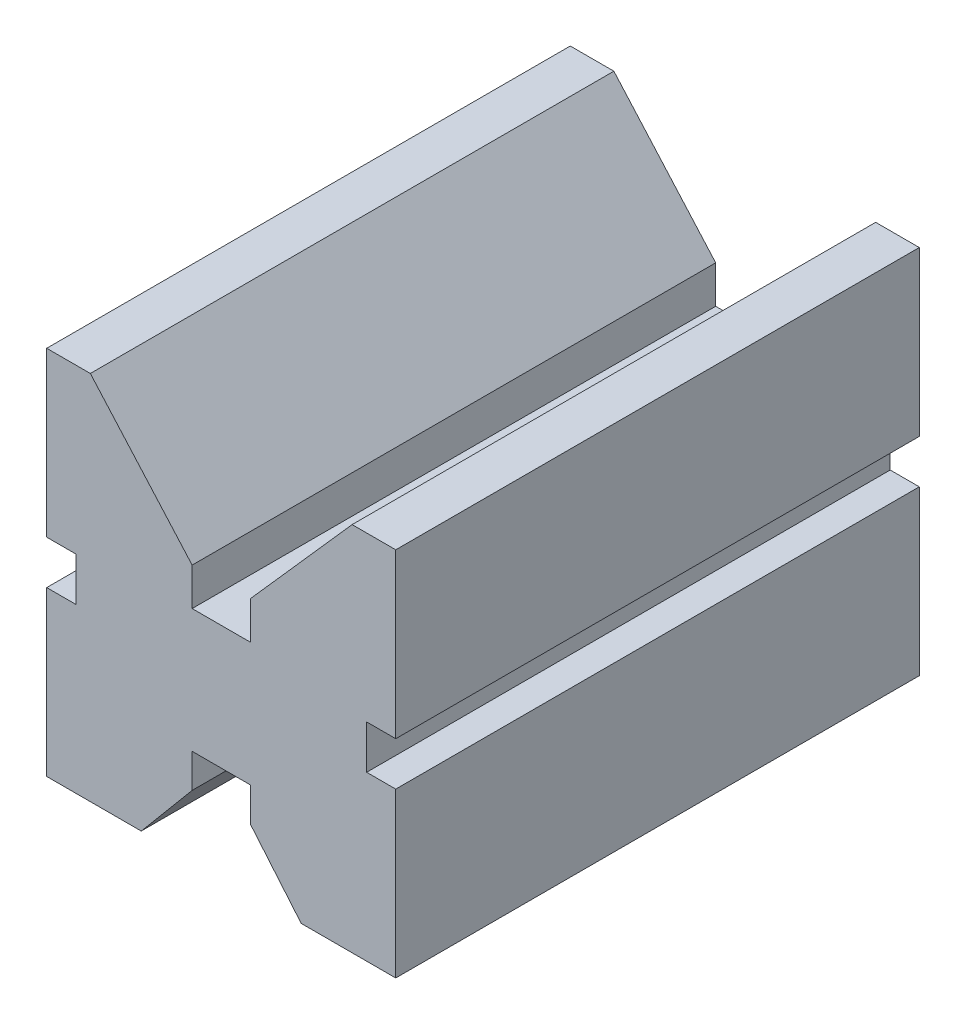
ISO-10303-21;
HEADER;
FILE_DESCRIPTION(('STEP AP214'),'2;1');
FILE_NAME('part.step','',(''),(''),'','','');
FILE_SCHEMA(('AUTOMOTIVE_DESIGN { 1 0 10303 214 1 1 1 1 }'));
ENDSEC;
DATA;
#1=APPLICATION_CONTEXT('core data for automotive mechanical design processes');
#2=APPLICATION_PROTOCOL_DEFINITION('international standard','automotive_design',2000,#1);
#3=PRODUCT_CONTEXT('',#1,'mechanical');
#4=PRODUCT('Part','Part','',(#3));
#5=PRODUCT_RELATED_PRODUCT_CATEGORY('part','',(#4));
#6=PRODUCT_DEFINITION_FORMATION('','',#4);
#7=PRODUCT_DEFINITION_CONTEXT('part definition',#1,'design');
#8=PRODUCT_DEFINITION('design','',#6,#7);
#9=PRODUCT_DEFINITION_SHAPE('','',#8);
#10=(LENGTH_UNIT() NAMED_UNIT(*) SI_UNIT(.MILLI.,.METRE.));
#11=(NAMED_UNIT(*) PLANE_ANGLE_UNIT() SI_UNIT($,.RADIAN.));
#12=(NAMED_UNIT(*) SI_UNIT($,.STERADIAN.) SOLID_ANGLE_UNIT());
#13=UNCERTAINTY_MEASURE_WITH_UNIT(LENGTH_MEASURE(1.E-05),#10,'distance_accuracy_value','');
#14=(GEOMETRIC_REPRESENTATION_CONTEXT(3) GLOBAL_UNCERTAINTY_ASSIGNED_CONTEXT((#13)) GLOBAL_UNIT_ASSIGNED_CONTEXT((#10,
#11,#12)) REPRESENTATION_CONTEXT('',''));
#15=CARTESIAN_POINT('',(0.,0.,0.));
#16=DIRECTION('',(0.,0.,1.));
#17=DIRECTION('',(1.,0.,0.));
#18=AXIS2_PLACEMENT_3D('',#15,#16,#17);
#19=CARTESIAN_POINT('',(24.,-3.,36.));
#20=DIRECTION('',(-1.,0.,0.));
#21=DIRECTION('',(0.,-1.,0.));
#22=AXIS2_PLACEMENT_3D('',#19,#20,#21);
#23=PLANE('',#22);
#24=DIRECTION('',(0.,1.,0.));
#25=VECTOR('',#24,1.);
#26=CARTESIAN_POINT('',(24.,-3.,-36.));
#27=LINE('',#26,#25);
#28=CARTESIAN_POINT('',(24.,-25.5,-36.));
#29=VERTEX_POINT('',#28);
#30=CARTESIAN_POINT('',(24.,-3.,-36.));
#31=VERTEX_POINT('',#30);
#32=EDGE_CURVE('E284',#29,#31,#27,.T.);
#33=ORIENTED_EDGE('',*,*,#32,.T.);
#34=DIRECTION('',(0.,0.,-1.));
#35=VECTOR('',#34,1.);
#36=CARTESIAN_POINT('',(24.,-3.,36.));
#37=LINE('',#36,#35);
#38=CARTESIAN_POINT('',(24.,-3.,36.));
#39=VERTEX_POINT('',#38);
#40=EDGE_CURVE('E11',#39,#31,#37,.T.);
#41=ORIENTED_EDGE('',*,*,#40,.F.);
#42=DIRECTION('',(0.,1.,0.));
#43=VECTOR('',#42,1.);
#44=CARTESIAN_POINT('',(24.,-3.,36.));
#45=LINE('',#44,#43);
#46=CARTESIAN_POINT('',(24.,-25.5,36.));
#47=VERTEX_POINT('',#46);
#48=EDGE_CURVE('E347',#47,#39,#45,.T.);
#49=ORIENTED_EDGE('',*,*,#48,.F.);
#50=DIRECTION('',(0.,0.,-1.));
#51=VECTOR('',#50,1.);
#52=CARTESIAN_POINT('',(24.,-25.5,36.));
#53=LINE('',#52,#51);
#54=EDGE_CURVE('E283',#47,#29,#53,.T.);
#55=ORIENTED_EDGE('',*,*,#54,.T.);
#56=EDGE_LOOP('',(#33,#41,#49,#55));
#57=FACE_BOUND('',#56,.T.);
#58=ADVANCED_FACE('F45',(#57),#23,.F.);
#59=CARTESIAN_POINT('',(24.,-3.,36.));
#60=DIRECTION('',(0.,-1.,0.));
#61=DIRECTION('',(1.,0.,0.));
#62=AXIS2_PLACEMENT_3D('',#59,#60,#61);
#63=PLANE('',#62);
#64=DIRECTION('',(-1.,0.,0.));
#65=VECTOR('',#64,1.);
#66=CARTESIAN_POINT('',(24.,-3.,-36.));
#67=LINE('',#66,#65);
#68=CARTESIAN_POINT('',(20.,-3.,-36.));
#69=VERTEX_POINT('',#68);
#70=EDGE_CURVE('E288',#31,#69,#67,.T.);
#71=ORIENTED_EDGE('',*,*,#70,.T.);
#72=DIRECTION('',(0.,0.,-1.));
#73=VECTOR('',#72,1.);
#74=CARTESIAN_POINT('',(20.,-3.,36.));
#75=LINE('',#74,#73);
#76=CARTESIAN_POINT('',(20.,-3.,36.));
#77=VERTEX_POINT('',#76);
#78=EDGE_CURVE('E53',#77,#69,#75,.T.);
#79=ORIENTED_EDGE('',*,*,#78,.F.);
#80=DIRECTION('',(-1.,0.,0.));
#81=VECTOR('',#80,1.);
#82=CARTESIAN_POINT('',(24.,-3.,36.));
#83=LINE('',#82,#81);
#84=EDGE_CURVE('E470',#39,#77,#83,.T.);
#85=ORIENTED_EDGE('',*,*,#84,.F.);
#86=ORIENTED_EDGE('',*,*,#40,.T.);
#87=EDGE_LOOP('',(#71,#79,#85,#86));
#88=FACE_BOUND('',#87,.T.);
#89=ADVANCED_FACE('F477',(#88),#63,.F.);
#90=CARTESIAN_POINT('',(20.,3.,36.));
#91=DIRECTION('',(-1.,0.,0.));
#92=DIRECTION('',(0.,0.,1.));
#93=AXIS2_PLACEMENT_3D('',#90,#91,#92);
#94=PLANE('',#93);
#95=DIRECTION('',(0.,1.,0.));
#96=VECTOR('',#95,1.);
#97=CARTESIAN_POINT('',(20.,3.,-36.));
#98=LINE('',#97,#96);
#99=CARTESIAN_POINT('',(20.,3.,-36.));
#100=VERTEX_POINT('',#99);
#101=EDGE_CURVE('E291',#69,#100,#98,.T.);
#102=ORIENTED_EDGE('',*,*,#101,.T.);
#103=DIRECTION('',(0.,0.,-1.));
#104=VECTOR('',#103,1.);
#105=CARTESIAN_POINT('',(20.,3.,36.));
#106=LINE('',#105,#104);
#107=CARTESIAN_POINT('',(20.,3.,36.));
#108=VERTEX_POINT('',#107);
#109=EDGE_CURVE('E398',#108,#100,#106,.T.);
#110=ORIENTED_EDGE('',*,*,#109,.F.);
#111=DIRECTION('',(0.,1.,0.));
#112=VECTOR('',#111,1.);
#113=CARTESIAN_POINT('',(20.,3.,36.));
#114=LINE('',#113,#112);
#115=EDGE_CURVE('E409',#77,#108,#114,.T.);
#116=ORIENTED_EDGE('',*,*,#115,.F.);
#117=ORIENTED_EDGE('',*,*,#78,.T.);
#118=EDGE_LOOP('',(#102,#110,#116,#117));
#119=FACE_BOUND('',#118,.T.);
#120=ADVANCED_FACE('F407',(#119),#94,.F.);
#121=CARTESIAN_POINT('',(24.,3.,36.));
#122=DIRECTION('',(0.,1.,0.));
#123=DIRECTION('',(-1.,0.,0.));
#124=AXIS2_PLACEMENT_3D('',#121,#122,#123);
#125=PLANE('',#124);
#126=DIRECTION('',(1.,0.,0.));
#127=VECTOR('',#126,1.);
#128=CARTESIAN_POINT('',(24.,3.,-36.));
#129=LINE('',#128,#127);
#130=CARTESIAN_POINT('',(24.,3.,-36.));
#131=VERTEX_POINT('',#130);
#132=EDGE_CURVE('E294',#100,#131,#129,.T.);
#133=ORIENTED_EDGE('',*,*,#132,.T.);
#134=DIRECTION('',(0.,0.,-1.));
#135=VECTOR('',#134,1.);
#136=CARTESIAN_POINT('',(24.,3.,36.));
#137=LINE('',#136,#135);
#138=CARTESIAN_POINT('',(24.,3.,36.));
#139=VERTEX_POINT('',#138);
#140=EDGE_CURVE('E394',#139,#131,#137,.T.);
#141=ORIENTED_EDGE('',*,*,#140,.F.);
#142=DIRECTION('',(1.,0.,0.));
#143=VECTOR('',#142,1.);
#144=CARTESIAN_POINT('',(24.,3.,36.));
#145=LINE('',#144,#143);
#146=EDGE_CURVE('E238',#108,#139,#145,.T.);
#147=ORIENTED_EDGE('',*,*,#146,.F.);
#148=ORIENTED_EDGE('',*,*,#109,.T.);
#149=EDGE_LOOP('',(#133,#141,#147,#148));
#150=FACE_BOUND('',#149,.T.);
#151=ADVANCED_FACE('F419',(#150),#125,.F.);
#152=CARTESIAN_POINT('',(24.,25.5,36.));
#153=DIRECTION('',(-1.,0.,0.));
#154=DIRECTION('',(0.,-1.,0.));
#155=AXIS2_PLACEMENT_3D('',#152,#153,#154);
#156=PLANE('',#155);
#157=DIRECTION('',(0.,1.,0.));
#158=VECTOR('',#157,1.);
#159=CARTESIAN_POINT('',(24.,25.5,-36.));
#160=LINE('',#159,#158);
#161=CARTESIAN_POINT('',(24.,25.5,-36.));
#162=VERTEX_POINT('',#161);
#163=EDGE_CURVE('E297',#131,#162,#160,.T.);
#164=ORIENTED_EDGE('',*,*,#163,.T.);
#165=DIRECTION('',(0.,0.,-1.));
#166=VECTOR('',#165,1.);
#167=CARTESIAN_POINT('',(24.,25.5,36.));
#168=LINE('',#167,#166);
#169=CARTESIAN_POINT('',(24.,25.5,36.));
#170=VERTEX_POINT('',#169);
#171=EDGE_CURVE('E391',#170,#162,#168,.T.);
#172=ORIENTED_EDGE('',*,*,#171,.F.);
#173=DIRECTION('',(0.,1.,0.));
#174=VECTOR('',#173,1.);
#175=CARTESIAN_POINT('',(24.,25.5,36.));
#176=LINE('',#175,#174);
#177=EDGE_CURVE('E229',#139,#170,#176,.T.);
#178=ORIENTED_EDGE('',*,*,#177,.F.);
#179=ORIENTED_EDGE('',*,*,#140,.T.);
#180=EDGE_LOOP('',(#164,#172,#178,#179));
#181=FACE_BOUND('',#180,.T.);
#182=ADVANCED_FACE('F422',(#181),#156,.F.);
#183=CARTESIAN_POINT('',(3.99999999999999,25.5,36.));
#184=DIRECTION('',(0.,-1.,0.));
#185=DIRECTION('',(1.,0.,0.));
#186=AXIS2_PLACEMENT_3D('',#183,#184,#185);
#187=PLANE('',#186);
#188=DIRECTION('',(-1.,0.,0.));
#189=VECTOR('',#188,1.);
#190=CARTESIAN_POINT('',(3.99999999999999,25.5,-36.));
#191=LINE('',#190,#189);
#192=CARTESIAN_POINT('',(18.,25.5,-36.));
#193=VERTEX_POINT('',#192);
#194=EDGE_CURVE('E222',#162,#193,#191,.T.);
#195=ORIENTED_EDGE('',*,*,#194,.T.);
#196=DIRECTION('',(0.,0.,1.));
#197=VECTOR('',#196,1.);
#198=CARTESIAN_POINT('',(18.,25.5,-36.));
#199=LINE('',#198,#197);
#200=CARTESIAN_POINT('',(18.,25.5,36.));
#201=VERTEX_POINT('',#200);
#202=EDGE_CURVE('E60',#193,#201,#199,.T.);
#203=ORIENTED_EDGE('',*,*,#202,.T.);
#204=DIRECTION('',(-1.,0.,0.));
#205=VECTOR('',#204,1.);
#206=CARTESIAN_POINT('',(3.99999999999999,25.5,36.));
#207=LINE('',#206,#205);
#208=EDGE_CURVE('E220',#170,#201,#207,.T.);
#209=ORIENTED_EDGE('',*,*,#208,.F.);
#210=ORIENTED_EDGE('',*,*,#171,.T.);
#211=EDGE_LOOP('',(#195,#203,#209,#210));
#212=FACE_BOUND('',#211,.T.);
#213=ADVANCED_FACE('F218',(#212),#187,.F.);
#214=CARTESIAN_POINT('',(3.99999999999999,25.5,36.));
#215=DIRECTION('',(1.,0.,0.));
#216=DIRECTION('',(0.,1.,0.));
#217=AXIS2_PLACEMENT_3D('',#214,#215,#216);
#218=PLANE('',#217);
#219=DIRECTION('',(0.,-1.,0.));
#220=VECTOR('',#219,1.);
#221=CARTESIAN_POINT('',(3.99999999999999,25.5,36.));
#222=LINE('',#221,#220);
#223=CARTESIAN_POINT('',(4.00000000000001,9.67587859093549,36.));
#224=VERTEX_POINT('',#223);
#225=CARTESIAN_POINT('',(4.,4.49999999999999,36.));
#226=VERTEX_POINT('',#225);
#227=EDGE_CURVE('E232',#224,#226,#222,.T.);
#228=ORIENTED_EDGE('',*,*,#227,.F.);
#229=DIRECTION('',(0.,0.,1.));
#230=VECTOR('',#229,1.);
#231=CARTESIAN_POINT('',(4.00000000000001,9.67587859093549,-36.));
#232=LINE('',#231,#230);
#233=CARTESIAN_POINT('',(4.00000000000001,9.67587859093549,-36.));
#234=VERTEX_POINT('',#233);
#235=EDGE_CURVE('E207',#234,#224,#232,.T.);
#236=ORIENTED_EDGE('',*,*,#235,.F.);
#237=DIRECTION('',(0.,-1.,0.));
#238=VECTOR('',#237,1.);
#239=CARTESIAN_POINT('',(3.99999999999999,25.5,-36.));
#240=LINE('',#239,#238);
#241=CARTESIAN_POINT('',(4.,4.49999999999999,-36.));
#242=VERTEX_POINT('',#241);
#243=EDGE_CURVE('E302',#234,#242,#240,.T.);
#244=ORIENTED_EDGE('',*,*,#243,.T.);
#245=DIRECTION('',(0.,0.,-1.));
#246=VECTOR('',#245,1.);
#247=CARTESIAN_POINT('',(4.,4.49999999999999,36.));
#248=LINE('',#247,#246);
#249=EDGE_CURVE('E387',#226,#242,#248,.T.);
#250=ORIENTED_EDGE('',*,*,#249,.F.);
#251=EDGE_LOOP('',(#228,#236,#244,#250));
#252=FACE_BOUND('',#251,.T.);
#253=ADVANCED_FACE('F549',(#252),#218,.F.);
#254=CARTESIAN_POINT('',(-4.00000000000001,4.49999999999999,36.));
#255=DIRECTION('',(0.,-1.,0.));
#256=DIRECTION('',(0.,0.,-1.));
#257=AXIS2_PLACEMENT_3D('',#254,#255,#256);
#258=PLANE('',#257);
#259=DIRECTION('',(-1.,0.,0.));
#260=VECTOR('',#259,1.);
#261=CARTESIAN_POINT('',(-4.00000000000001,4.49999999999999,-36.));
#262=LINE('',#261,#260);
#263=CARTESIAN_POINT('',(-4.00000000000001,4.49999999999999,-36.));
#264=VERTEX_POINT('',#263);
#265=EDGE_CURVE('E305',#242,#264,#262,.T.);
#266=ORIENTED_EDGE('',*,*,#265,.T.);
#267=DIRECTION('',(0.,0.,-1.));
#268=VECTOR('',#267,1.);
#269=CARTESIAN_POINT('',(-4.00000000000001,4.49999999999999,36.));
#270=LINE('',#269,#268);
#271=CARTESIAN_POINT('',(-4.00000000000001,4.49999999999999,36.));
#272=VERTEX_POINT('',#271);
#273=EDGE_CURVE('E383',#272,#264,#270,.T.);
#274=ORIENTED_EDGE('',*,*,#273,.F.);
#275=DIRECTION('',(-1.,0.,0.));
#276=VECTOR('',#275,1.);
#277=CARTESIAN_POINT('',(-4.00000000000001,4.49999999999999,36.));
#278=LINE('',#277,#276);
#279=EDGE_CURVE('E236',#226,#272,#278,.T.);
#280=ORIENTED_EDGE('',*,*,#279,.F.);
#281=ORIENTED_EDGE('',*,*,#249,.T.);
#282=EDGE_LOOP('',(#266,#274,#280,#281));
#283=FACE_BOUND('',#282,.T.);
#284=ADVANCED_FACE('F546',(#283),#258,.F.);
#285=CARTESIAN_POINT('',(-4.,25.5,36.));
#286=DIRECTION('',(-1.,0.,0.));
#287=DIRECTION('',(0.,-1.,0.));
#288=AXIS2_PLACEMENT_3D('',#285,#286,#287);
#289=PLANE('',#288);
#290=DIRECTION('',(0.,1.,0.));
#291=VECTOR('',#290,1.);
#292=CARTESIAN_POINT('',(-4.,25.5,-36.));
#293=LINE('',#292,#291);
#294=CARTESIAN_POINT('',(-4.00000000000001,9.6758785909355,-36.));
#295=VERTEX_POINT('',#294);
#296=EDGE_CURVE('E308',#264,#295,#293,.T.);
#297=ORIENTED_EDGE('',*,*,#296,.T.);
#298=DIRECTION('',(0.,0.,1.));
#299=VECTOR('',#298,1.);
#300=CARTESIAN_POINT('',(-4.00000000000001,9.67587859093549,-36.));
#301=LINE('',#300,#299);
#302=CARTESIAN_POINT('',(-4.00000000000001,9.67587859093549,36.));
#303=VERTEX_POINT('',#302);
#304=EDGE_CURVE('E68',#295,#303,#301,.T.);
#305=ORIENTED_EDGE('',*,*,#304,.T.);
#306=DIRECTION('',(0.,1.,0.));
#307=VECTOR('',#306,1.);
#308=CARTESIAN_POINT('',(-4.,25.5,36.));
#309=LINE('',#308,#307);
#310=EDGE_CURVE('E244',#272,#303,#309,.T.);
#311=ORIENTED_EDGE('',*,*,#310,.F.);
#312=ORIENTED_EDGE('',*,*,#273,.T.);
#313=EDGE_LOOP('',(#297,#305,#311,#312));
#314=FACE_BOUND('',#313,.T.);
#315=ADVANCED_FACE('F541',(#314),#289,.F.);
#316=CARTESIAN_POINT('',(-24.,25.5,36.));
#317=DIRECTION('',(0.,-1.,0.));
#318=DIRECTION('',(1.,0.,0.));
#319=AXIS2_PLACEMENT_3D('',#316,#317,#318);
#320=PLANE('',#319);
#321=DIRECTION('',(-1.,0.,0.));
#322=VECTOR('',#321,1.);
#323=CARTESIAN_POINT('',(-24.,25.5,36.));
#324=LINE('',#323,#322);
#325=CARTESIAN_POINT('',(-18.,25.5,36.));
#326=VERTEX_POINT('',#325);
#327=CARTESIAN_POINT('',(-24.,25.5,36.));
#328=VERTEX_POINT('',#327);
#329=EDGE_CURVE('E248',#326,#328,#324,.T.);
#330=ORIENTED_EDGE('',*,*,#329,.F.);
#331=DIRECTION('',(0.,0.,1.));
#332=VECTOR('',#331,1.);
#333=CARTESIAN_POINT('',(-18.,25.5,-36.));
#334=LINE('',#333,#332);
#335=CARTESIAN_POINT('',(-18.,25.5,-36.));
#336=VERTEX_POINT('',#335);
#337=EDGE_CURVE('E460',#336,#326,#334,.T.);
#338=ORIENTED_EDGE('',*,*,#337,.F.);
#339=DIRECTION('',(-1.,0.,0.));
#340=VECTOR('',#339,1.);
#341=CARTESIAN_POINT('',(-24.,25.5,-36.));
#342=LINE('',#341,#340);
#343=CARTESIAN_POINT('',(-24.,25.5,-36.));
#344=VERTEX_POINT('',#343);
#345=EDGE_CURVE('E312',#336,#344,#342,.T.);
#346=ORIENTED_EDGE('',*,*,#345,.T.);
#347=DIRECTION('',(0.,0.,-1.));
#348=VECTOR('',#347,1.);
#349=CARTESIAN_POINT('',(-24.,25.5,36.));
#350=LINE('',#349,#348);
#351=EDGE_CURVE('E379',#328,#344,#350,.T.);
#352=ORIENTED_EDGE('',*,*,#351,.F.);
#353=EDGE_LOOP('',(#330,#338,#346,#352));
#354=FACE_BOUND('',#353,.T.);
#355=ADVANCED_FACE('F537',(#354),#320,.F.);
#356=CARTESIAN_POINT('',(-24.,25.5,36.));
#357=DIRECTION('',(1.,0.,0.));
#358=DIRECTION('',(0.,1.,0.));
#359=AXIS2_PLACEMENT_3D('',#356,#357,#358);
#360=PLANE('',#359);
#361=DIRECTION('',(0.,-1.,0.));
#362=VECTOR('',#361,1.);
#363=CARTESIAN_POINT('',(-24.,25.5,-36.));
#364=LINE('',#363,#362);
#365=CARTESIAN_POINT('',(-24.,3.,-36.));
#366=VERTEX_POINT('',#365);
#367=EDGE_CURVE('E315',#344,#366,#364,.T.);
#368=ORIENTED_EDGE('',*,*,#367,.T.);
#369=DIRECTION('',(0.,0.,-1.));
#370=VECTOR('',#369,1.);
#371=CARTESIAN_POINT('',(-24.,3.,36.));
#372=LINE('',#371,#370);
#373=CARTESIAN_POINT('',(-24.,3.,36.));
#374=VERTEX_POINT('',#373);
#375=EDGE_CURVE('E375',#374,#366,#372,.T.);
#376=ORIENTED_EDGE('',*,*,#375,.F.);
#377=DIRECTION('',(0.,-1.,0.));
#378=VECTOR('',#377,1.);
#379=CARTESIAN_POINT('',(-24.,25.5,36.));
#380=LINE('',#379,#378);
#381=EDGE_CURVE('E251',#328,#374,#380,.T.);
#382=ORIENTED_EDGE('',*,*,#381,.F.);
#383=ORIENTED_EDGE('',*,*,#351,.T.);
#384=EDGE_LOOP('',(#368,#376,#382,#383));
#385=FACE_BOUND('',#384,.T.);
#386=ADVANCED_FACE('F533',(#385),#360,.F.);
#387=CARTESIAN_POINT('',(-24.,3.,36.));
#388=DIRECTION('',(0.,1.,0.));
#389=DIRECTION('',(-1.,0.,0.));
#390=AXIS2_PLACEMENT_3D('',#387,#388,#389);
#391=PLANE('',#390);
#392=DIRECTION('',(1.,0.,0.));
#393=VECTOR('',#392,1.);
#394=CARTESIAN_POINT('',(-24.,3.,-36.));
#395=LINE('',#394,#393);
#396=CARTESIAN_POINT('',(-20.,3.,-36.));
#397=VERTEX_POINT('',#396);
#398=EDGE_CURVE('E318',#366,#397,#395,.T.);
#399=ORIENTED_EDGE('',*,*,#398,.T.);
#400=DIRECTION('',(0.,0.,-1.));
#401=VECTOR('',#400,1.);
#402=CARTESIAN_POINT('',(-20.,3.,36.));
#403=LINE('',#402,#401);
#404=CARTESIAN_POINT('',(-20.,3.,36.));
#405=VERTEX_POINT('',#404);
#406=EDGE_CURVE('E371',#405,#397,#403,.T.);
#407=ORIENTED_EDGE('',*,*,#406,.F.);
#408=DIRECTION('',(1.,0.,0.));
#409=VECTOR('',#408,1.);
#410=CARTESIAN_POINT('',(-24.,3.,36.));
#411=LINE('',#410,#409);
#412=EDGE_CURVE('E254',#374,#405,#411,.T.);
#413=ORIENTED_EDGE('',*,*,#412,.F.);
#414=ORIENTED_EDGE('',*,*,#375,.T.);
#415=EDGE_LOOP('',(#399,#407,#413,#414));
#416=FACE_BOUND('',#415,.T.);
#417=ADVANCED_FACE('F528',(#416),#391,.F.);
#418=CARTESIAN_POINT('',(-20.,3.,36.));
#419=DIRECTION('',(1.,0.,0.));
#420=DIRECTION('',(0.,0.,-1.));
#421=AXIS2_PLACEMENT_3D('',#418,#419,#420);
#422=PLANE('',#421);
#423=DIRECTION('',(0.,-1.,0.));
#424=VECTOR('',#423,1.);
#425=CARTESIAN_POINT('',(-20.,3.,-36.));
#426=LINE('',#425,#424);
#427=CARTESIAN_POINT('',(-20.,-3.,-36.));
#428=VERTEX_POINT('',#427);
#429=EDGE_CURVE('E321',#397,#428,#426,.T.);
#430=ORIENTED_EDGE('',*,*,#429,.T.);
#431=DIRECTION('',(0.,0.,-1.));
#432=VECTOR('',#431,1.);
#433=CARTESIAN_POINT('',(-20.,-3.,36.));
#434=LINE('',#433,#432);
#435=CARTESIAN_POINT('',(-20.,-3.,36.));
#436=VERTEX_POINT('',#435);
#437=EDGE_CURVE('E367',#436,#428,#434,.T.);
#438=ORIENTED_EDGE('',*,*,#437,.F.);
#439=DIRECTION('',(0.,-1.,0.));
#440=VECTOR('',#439,1.);
#441=CARTESIAN_POINT('',(-20.,3.,36.));
#442=LINE('',#441,#440);
#443=EDGE_CURVE('E257',#405,#436,#442,.T.);
#444=ORIENTED_EDGE('',*,*,#443,.F.);
#445=ORIENTED_EDGE('',*,*,#406,.T.);
#446=EDGE_LOOP('',(#430,#438,#444,#445));
#447=FACE_BOUND('',#446,.T.);
#448=ADVANCED_FACE('F522',(#447),#422,.F.);
#449=CARTESIAN_POINT('',(-24.,-3.,36.));
#450=DIRECTION('',(0.,-1.,0.));
#451=DIRECTION('',(1.,0.,0.));
#452=AXIS2_PLACEMENT_3D('',#449,#450,#451);
#453=PLANE('',#452);
#454=DIRECTION('',(-1.,0.,0.));
#455=VECTOR('',#454,1.);
#456=CARTESIAN_POINT('',(-24.,-3.,-36.));
#457=LINE('',#456,#455);
#458=CARTESIAN_POINT('',(-24.,-3.,-36.));
#459=VERTEX_POINT('',#458);
#460=EDGE_CURVE('E324',#428,#459,#457,.T.);
#461=ORIENTED_EDGE('',*,*,#460,.T.);
#462=DIRECTION('',(0.,0.,-1.));
#463=VECTOR('',#462,1.);
#464=CARTESIAN_POINT('',(-24.,-3.,36.));
#465=LINE('',#464,#463);
#466=CARTESIAN_POINT('',(-24.,-3.,36.));
#467=VERTEX_POINT('',#466);
#468=EDGE_CURVE('E363',#467,#459,#465,.T.);
#469=ORIENTED_EDGE('',*,*,#468,.F.);
#470=DIRECTION('',(-1.,0.,0.));
#471=VECTOR('',#470,1.);
#472=CARTESIAN_POINT('',(-24.,-3.,36.));
#473=LINE('',#472,#471);
#474=EDGE_CURVE('E260',#436,#467,#473,.T.);
#475=ORIENTED_EDGE('',*,*,#474,.F.);
#476=ORIENTED_EDGE('',*,*,#437,.T.);
#477=EDGE_LOOP('',(#461,#469,#475,#476));
#478=FACE_BOUND('',#477,.T.);
#479=ADVANCED_FACE('F518',(#478),#453,.F.);
#480=CARTESIAN_POINT('',(-24.,-3.,36.));
#481=DIRECTION('',(1.,0.,0.));
#482=DIRECTION('',(0.,1.,0.));
#483=AXIS2_PLACEMENT_3D('',#480,#481,#482);
#484=PLANE('',#483);
#485=DIRECTION('',(0.,-1.,0.));
#486=VECTOR('',#485,1.);
#487=CARTESIAN_POINT('',(-24.,-3.,-36.));
#488=LINE('',#487,#486);
#489=CARTESIAN_POINT('',(-24.,-25.5,-36.));
#490=VERTEX_POINT('',#489);
#491=EDGE_CURVE('E327',#459,#490,#488,.T.);
#492=ORIENTED_EDGE('',*,*,#491,.T.);
#493=DIRECTION('',(0.,0.,-1.));
#494=VECTOR('',#493,1.);
#495=CARTESIAN_POINT('',(-24.,-25.5,36.));
#496=LINE('',#495,#494);
#497=CARTESIAN_POINT('',(-24.,-25.5,36.));
#498=VERTEX_POINT('',#497);
#499=EDGE_CURVE('E359',#498,#490,#496,.T.);
#500=ORIENTED_EDGE('',*,*,#499,.F.);
#501=DIRECTION('',(0.,-1.,0.));
#502=VECTOR('',#501,1.);
#503=CARTESIAN_POINT('',(-24.,-3.,36.));
#504=LINE('',#503,#502);
#505=EDGE_CURVE('E263',#467,#498,#504,.T.);
#506=ORIENTED_EDGE('',*,*,#505,.F.);
#507=ORIENTED_EDGE('',*,*,#468,.T.);
#508=EDGE_LOOP('',(#492,#500,#506,#507));
#509=FACE_BOUND('',#508,.T.);
#510=ADVANCED_FACE('F514',(#509),#484,.F.);
#511=CARTESIAN_POINT('',(-24.,-25.5,36.));
#512=DIRECTION('',(0.,1.,0.));
#513=DIRECTION('',(-1.,0.,0.));
#514=AXIS2_PLACEMENT_3D('',#511,#512,#513);
#515=PLANE('',#514);
#516=DIRECTION('',(1.,0.,0.));
#517=VECTOR('',#516,1.);
#518=CARTESIAN_POINT('',(-24.,-25.5,-36.));
#519=LINE('',#518,#517);
#520=CARTESIAN_POINT('',(-11.,-25.5,-36.));
#521=VERTEX_POINT('',#520);
#522=EDGE_CURVE('E330',#490,#521,#519,.T.);
#523=ORIENTED_EDGE('',*,*,#522,.T.);
#524=DIRECTION('',(0.,0.,1.));
#525=VECTOR('',#524,1.);
#526=CARTESIAN_POINT('',(-11.,-25.5,-36.));
#527=LINE('',#526,#525);
#528=CARTESIAN_POINT('',(-11.,-25.5,36.));
#529=VERTEX_POINT('',#528);
#530=EDGE_CURVE('E448',#521,#529,#527,.T.);
#531=ORIENTED_EDGE('',*,*,#530,.T.);
#532=DIRECTION('',(1.,0.,0.));
#533=VECTOR('',#532,1.);
#534=CARTESIAN_POINT('',(-24.,-25.5,36.));
#535=LINE('',#534,#533);
#536=EDGE_CURVE('E266',#498,#529,#535,.T.);
#537=ORIENTED_EDGE('',*,*,#536,.F.);
#538=ORIENTED_EDGE('',*,*,#499,.T.);
#539=EDGE_LOOP('',(#523,#531,#537,#538));
#540=FACE_BOUND('',#539,.T.);
#541=ADVANCED_FACE('F508',(#540),#515,.F.);
#542=CARTESIAN_POINT('',(-4.,-25.5,36.));
#543=DIRECTION('',(-1.,0.,0.));
#544=DIRECTION('',(0.,-1.,0.));
#545=AXIS2_PLACEMENT_3D('',#542,#543,#544);
#546=PLANE('',#545);
#547=DIRECTION('',(0.,1.,0.));
#548=VECTOR('',#547,1.);
#549=CARTESIAN_POINT('',(-4.,-25.5,36.));
#550=LINE('',#549,#548);
#551=CARTESIAN_POINT('',(-4.,-17.1577248518405,36.));
#552=VERTEX_POINT('',#551);
#553=CARTESIAN_POINT('',(-4.,-12.5,36.));
#554=VERTEX_POINT('',#553);
#555=EDGE_CURVE('E270',#552,#554,#550,.T.);
#556=ORIENTED_EDGE('',*,*,#555,.F.);
#557=DIRECTION('',(0.,0.,1.));
#558=VECTOR('',#557,1.);
#559=CARTESIAN_POINT('',(-4.,-17.1577248518405,-36.));
#560=LINE('',#559,#558);
#561=CARTESIAN_POINT('',(-4.,-17.1577248518405,-36.));
#562=VERTEX_POINT('',#561);
#563=EDGE_CURVE('E444',#562,#552,#560,.T.);
#564=ORIENTED_EDGE('',*,*,#563,.F.);
#565=DIRECTION('',(0.,1.,0.));
#566=VECTOR('',#565,1.);
#567=CARTESIAN_POINT('',(-4.,-25.5,-36.));
#568=LINE('',#567,#566);
#569=CARTESIAN_POINT('',(-4.,-12.5,-36.));
#570=VERTEX_POINT('',#569);
#571=EDGE_CURVE('E334',#562,#570,#568,.T.);
#572=ORIENTED_EDGE('',*,*,#571,.T.);
#573=DIRECTION('',(0.,0.,-1.));
#574=VECTOR('',#573,1.);
#575=CARTESIAN_POINT('',(-4.,-12.5,36.));
#576=LINE('',#575,#574);
#577=EDGE_CURVE('E355',#554,#570,#576,.T.);
#578=ORIENTED_EDGE('',*,*,#577,.F.);
#579=EDGE_LOOP('',(#556,#564,#572,#578));
#580=FACE_BOUND('',#579,.T.);
#581=ADVANCED_FACE('F500',(#580),#546,.F.);
#582=CARTESIAN_POINT('',(-4.,-12.5,36.));
#583=DIRECTION('',(0.,1.,0.));
#584=DIRECTION('',(0.,0.,1.));
#585=AXIS2_PLACEMENT_3D('',#582,#583,#584);
#586=PLANE('',#585);
#587=DIRECTION('',(1.,0.,0.));
#588=VECTOR('',#587,1.);
#589=CARTESIAN_POINT('',(-4.,-12.5,-36.));
#590=LINE('',#589,#588);
#591=CARTESIAN_POINT('',(4.,-12.5,-36.));
#592=VERTEX_POINT('',#591);
#593=EDGE_CURVE('E337',#570,#592,#590,.T.);
#594=ORIENTED_EDGE('',*,*,#593,.T.);
#595=DIRECTION('',(0.,0.,-1.));
#596=VECTOR('',#595,1.);
#597=CARTESIAN_POINT('',(4.,-12.5,36.));
#598=LINE('',#597,#596);
#599=CARTESIAN_POINT('',(4.,-12.5,36.));
#600=VERTEX_POINT('',#599);
#601=EDGE_CURVE('E351',#600,#592,#598,.T.);
#602=ORIENTED_EDGE('',*,*,#601,.F.);
#603=DIRECTION('',(1.,0.,0.));
#604=VECTOR('',#603,1.);
#605=CARTESIAN_POINT('',(-4.,-12.5,36.));
#606=LINE('',#605,#604);
#607=EDGE_CURVE('E273',#554,#600,#606,.T.);
#608=ORIENTED_EDGE('',*,*,#607,.F.);
#609=ORIENTED_EDGE('',*,*,#577,.T.);
#610=EDGE_LOOP('',(#594,#602,#608,#609));
#611=FACE_BOUND('',#610,.T.);
#612=ADVANCED_FACE('F496',(#611),#586,.F.);
#613=CARTESIAN_POINT('',(3.99999999999999,-25.5,36.));
#614=DIRECTION('',(1.,0.,0.));
#615=DIRECTION('',(0.,1.,0.));
#616=AXIS2_PLACEMENT_3D('',#613,#614,#615);
#617=PLANE('',#616);
#618=DIRECTION('',(0.,-1.,0.));
#619=VECTOR('',#618,1.);
#620=CARTESIAN_POINT('',(3.99999999999999,-25.5,-36.));
#621=LINE('',#620,#619);
#622=CARTESIAN_POINT('',(4.,-17.1577248518405,-36.));
#623=VERTEX_POINT('',#622);
#624=EDGE_CURVE('E340',#592,#623,#621,.T.);
#625=ORIENTED_EDGE('',*,*,#624,.T.);
#626=DIRECTION('',(0.,0.,1.));
#627=VECTOR('',#626,1.);
#628=CARTESIAN_POINT('',(4.,-17.1577248518405,-36.));
#629=LINE('',#628,#627);
#630=CARTESIAN_POINT('',(4.,-17.1577248518405,36.));
#631=VERTEX_POINT('',#630);
#632=EDGE_CURVE('E434',#623,#631,#629,.T.);
#633=ORIENTED_EDGE('',*,*,#632,.T.);
#634=DIRECTION('',(0.,-1.,0.));
#635=VECTOR('',#634,1.);
#636=CARTESIAN_POINT('',(3.99999999999999,-25.5,36.));
#637=LINE('',#636,#635);
#638=EDGE_CURVE('E276',#600,#631,#637,.T.);
#639=ORIENTED_EDGE('',*,*,#638,.F.);
#640=ORIENTED_EDGE('',*,*,#601,.T.);
#641=EDGE_LOOP('',(#625,#633,#639,#640));
#642=FACE_BOUND('',#641,.T.);
#643=ADVANCED_FACE('F493',(#642),#617,.F.);
#644=CARTESIAN_POINT('',(3.99999999999999,-25.5,36.));
#645=DIRECTION('',(0.,1.,0.));
#646=DIRECTION('',(-1.,0.,0.));
#647=AXIS2_PLACEMENT_3D('',#644,#645,#646);
#648=PLANE('',#647);
#649=DIRECTION('',(1.,0.,0.));
#650=VECTOR('',#649,1.);
#651=CARTESIAN_POINT('',(3.99999999999999,-25.5,36.));
#652=LINE('',#651,#650);
#653=CARTESIAN_POINT('',(11.,-25.5,36.));
#654=VERTEX_POINT('',#653);
#655=EDGE_CURVE('E280',#654,#47,#652,.T.);
#656=ORIENTED_EDGE('',*,*,#655,.F.);
#657=DIRECTION('',(0.,0.,1.));
#658=VECTOR('',#657,1.);
#659=CARTESIAN_POINT('',(11.,-25.5,-36.));
#660=LINE('',#659,#658);
#661=CARTESIAN_POINT('',(11.,-25.5,-36.));
#662=VERTEX_POINT('',#661);
#663=EDGE_CURVE('E430',#662,#654,#660,.T.);
#664=ORIENTED_EDGE('',*,*,#663,.F.);
#665=DIRECTION('',(1.,0.,0.));
#666=VECTOR('',#665,1.);
#667=CARTESIAN_POINT('',(3.99999999999999,-25.5,-36.));
#668=LINE('',#667,#666);
#669=EDGE_CURVE('E344',#662,#29,#668,.T.);
#670=ORIENTED_EDGE('',*,*,#669,.T.);
#671=ORIENTED_EDGE('',*,*,#54,.F.);
#672=EDGE_LOOP('',(#656,#664,#670,#671));
#673=FACE_BOUND('',#672,.T.);
#674=ADVANCED_FACE('F485',(#673),#648,.F.);
#675=CARTESIAN_POINT('',(0.,0.,36.));
#676=DIRECTION('',(0.,0.,1.));
#677=DIRECTION('',(1.,0.,0.));
#678=AXIS2_PLACEMENT_3D('',#675,#676,#677);
#679=PLANE('',#678);
#680=DIRECTION('',(-0.64278760968654,-0.766044443118977,0.));
#681=VECTOR('',#680,1.);
#682=CARTESIAN_POINT('',(-4.,-17.1577248518405,36.));
#683=LINE('',#682,#681);
#684=EDGE_CURVE('E438',#552,#529,#683,.T.);
#685=ORIENTED_EDGE('',*,*,#684,.F.);
#686=ORIENTED_EDGE('',*,*,#555,.T.);
#687=ORIENTED_EDGE('',*,*,#607,.T.);
#688=ORIENTED_EDGE('',*,*,#638,.T.);
#689=DIRECTION('',(-0.64278760968654,0.766044443118977,0.));
#690=VECTOR('',#689,1.);
#691=CARTESIAN_POINT('',(4.,-17.1577248518405,36.));
#692=LINE('',#691,#690);
#693=EDGE_CURVE('E224',#654,#631,#692,.T.);
#694=ORIENTED_EDGE('',*,*,#693,.F.);
#695=ORIENTED_EDGE('',*,*,#655,.T.);
#696=ORIENTED_EDGE('',*,*,#48,.T.);
#697=ORIENTED_EDGE('',*,*,#84,.T.);
#698=ORIENTED_EDGE('',*,*,#115,.T.);
#699=ORIENTED_EDGE('',*,*,#146,.T.);
#700=ORIENTED_EDGE('',*,*,#177,.T.);
#701=ORIENTED_EDGE('',*,*,#208,.T.);
#702=DIRECTION('',(0.662620048215739,0.748955720789001,0.));
#703=VECTOR('',#702,1.);
#704=CARTESIAN_POINT('',(4.00000000000001,9.67587859093549,36.));
#705=LINE('',#704,#703);
#706=EDGE_CURVE('E204',#224,#201,#705,.T.);
#707=ORIENTED_EDGE('',*,*,#706,.F.);
#708=ORIENTED_EDGE('',*,*,#227,.T.);
#709=ORIENTED_EDGE('',*,*,#279,.T.);
#710=ORIENTED_EDGE('',*,*,#310,.T.);
#711=DIRECTION('',(0.662620048215739,-0.748955720789001,0.));
#712=VECTOR('',#711,1.);
#713=CARTESIAN_POINT('',(-4.00000000000001,9.67587859093549,36.));
#714=LINE('',#713,#712);
#715=EDGE_CURVE('E212',#326,#303,#714,.T.);
#716=ORIENTED_EDGE('',*,*,#715,.F.);
#717=ORIENTED_EDGE('',*,*,#329,.T.);
#718=ORIENTED_EDGE('',*,*,#381,.T.);
#719=ORIENTED_EDGE('',*,*,#412,.T.);
#720=ORIENTED_EDGE('',*,*,#443,.T.);
#721=ORIENTED_EDGE('',*,*,#474,.T.);
#722=ORIENTED_EDGE('',*,*,#505,.T.);
#723=ORIENTED_EDGE('',*,*,#536,.T.);
#724=EDGE_LOOP('',(#685,#686,#687,#688,#694,#695,#696,#697,#698,#699,#700,#701,#707,#708,#709,
#710,#716,#717,#718,#719,#720,#721,#722,#723));
#725=FACE_BOUND('',#724,.T.);
#726=ADVANCED_FACE('F227',(#725),#679,.T.);
#727=CARTESIAN_POINT('',(0.,0.,-36.));
#728=DIRECTION('',(0.,0.,1.));
#729=DIRECTION('',(1.,0.,0.));
#730=AXIS2_PLACEMENT_3D('',#727,#728,#729);
#731=PLANE('',#730);
#732=ORIENTED_EDGE('',*,*,#571,.F.);
#733=DIRECTION('',(-0.64278760968654,-0.766044443118977,0.));
#734=VECTOR('',#733,1.);
#735=CARTESIAN_POINT('',(-4.,-17.1577248518405,-36.));
#736=LINE('',#735,#734);
#737=EDGE_CURVE('E447',#562,#521,#736,.T.);
#738=ORIENTED_EDGE('',*,*,#737,.T.);
#739=ORIENTED_EDGE('',*,*,#522,.F.);
#740=ORIENTED_EDGE('',*,*,#491,.F.);
#741=ORIENTED_EDGE('',*,*,#460,.F.);
#742=ORIENTED_EDGE('',*,*,#429,.F.);
#743=ORIENTED_EDGE('',*,*,#398,.F.);
#744=ORIENTED_EDGE('',*,*,#367,.F.);
#745=ORIENTED_EDGE('',*,*,#345,.F.);
#746=DIRECTION('',(0.662620048215739,-0.748955720789001,0.));
#747=VECTOR('',#746,1.);
#748=CARTESIAN_POINT('',(-4.00000000000001,9.67587859093549,-36.));
#749=LINE('',#748,#747);
#750=EDGE_CURVE('E457',#336,#295,#749,.T.);
#751=ORIENTED_EDGE('',*,*,#750,.T.);
#752=ORIENTED_EDGE('',*,*,#296,.F.);
#753=ORIENTED_EDGE('',*,*,#265,.F.);
#754=ORIENTED_EDGE('',*,*,#243,.F.);
#755=DIRECTION('',(0.662620048215739,0.748955720789001,0.));
#756=VECTOR('',#755,1.);
#757=CARTESIAN_POINT('',(4.00000000000001,9.67587859093549,-36.));
#758=LINE('',#757,#756);
#759=EDGE_CURVE('E213',#234,#193,#758,.T.);
#760=ORIENTED_EDGE('',*,*,#759,.T.);
#761=ORIENTED_EDGE('',*,*,#194,.F.);
#762=ORIENTED_EDGE('',*,*,#163,.F.);
#763=ORIENTED_EDGE('',*,*,#132,.F.);
#764=ORIENTED_EDGE('',*,*,#101,.F.);
#765=ORIENTED_EDGE('',*,*,#70,.F.);
#766=ORIENTED_EDGE('',*,*,#32,.F.);
#767=ORIENTED_EDGE('',*,*,#669,.F.);
#768=DIRECTION('',(-0.64278760968654,0.766044443118977,0.));
#769=VECTOR('',#768,1.);
#770=CARTESIAN_POINT('',(4.,-17.1577248518405,-36.));
#771=LINE('',#770,#769);
#772=EDGE_CURVE('E433',#662,#623,#771,.T.);
#773=ORIENTED_EDGE('',*,*,#772,.T.);
#774=ORIENTED_EDGE('',*,*,#624,.F.);
#775=ORIENTED_EDGE('',*,*,#593,.F.);
#776=EDGE_LOOP('',(#732,#738,#739,#740,#741,#742,#743,#744,#745,#751,#752,#753,#754,#760,#761,
#762,#763,#764,#765,#766,#767,#773,#774,#775));
#777=FACE_BOUND('',#776,.T.);
#778=ADVANCED_FACE('F414',(#777),#731,.F.);
#779=CARTESIAN_POINT('',(-4.00000000000001,9.67587859093549,-36.));
#780=DIRECTION('',(-0.748955720789001,-0.662620048215739,0.));
#781=DIRECTION('',(0.662620048215739,-0.748955720789001,0.));
#782=AXIS2_PLACEMENT_3D('',#779,#780,#781);
#783=PLANE('',#782);
#784=ORIENTED_EDGE('',*,*,#715,.T.);
#785=ORIENTED_EDGE('',*,*,#304,.F.);
#786=ORIENTED_EDGE('',*,*,#750,.F.);
#787=ORIENTED_EDGE('',*,*,#337,.T.);
#788=EDGE_LOOP('',(#784,#785,#786,#787));
#789=FACE_BOUND('',#788,.T.);
#790=ADVANCED_FACE('F551',(#789),#783,.F.);
#791=CARTESIAN_POINT('',(4.00000000000001,9.67587859093549,-36.));
#792=DIRECTION('',(0.748955720789001,-0.662620048215739,0.));
#793=DIRECTION('',(0.662620048215739,0.748955720789001,0.));
#794=AXIS2_PLACEMENT_3D('',#791,#792,#793);
#795=PLANE('',#794);
#796=ORIENTED_EDGE('',*,*,#706,.T.);
#797=ORIENTED_EDGE('',*,*,#202,.F.);
#798=ORIENTED_EDGE('',*,*,#759,.F.);
#799=ORIENTED_EDGE('',*,*,#235,.T.);
#800=EDGE_LOOP('',(#796,#797,#798,#799));
#801=FACE_BOUND('',#800,.T.);
#802=ADVANCED_FACE('F205',(#801),#795,.F.);
#803=CARTESIAN_POINT('',(4.,-17.1577248518405,-36.));
#804=DIRECTION('',(0.766044443118977,0.64278760968654,0.));
#805=DIRECTION('',(-0.64278760968654,0.766044443118977,0.));
#806=AXIS2_PLACEMENT_3D('',#803,#804,#805);
#807=PLANE('',#806);
#808=ORIENTED_EDGE('',*,*,#693,.T.);
#809=ORIENTED_EDGE('',*,*,#632,.F.);
#810=ORIENTED_EDGE('',*,*,#772,.F.);
#811=ORIENTED_EDGE('',*,*,#663,.T.);
#812=EDGE_LOOP('',(#808,#809,#810,#811));
#813=FACE_BOUND('',#812,.T.);
#814=ADVANCED_FACE('F488',(#813),#807,.F.);
#815=CARTESIAN_POINT('',(-4.,-17.1577248518405,-36.));
#816=DIRECTION('',(-0.766044443118977,0.64278760968654,0.));
#817=DIRECTION('',(-0.64278760968654,-0.766044443118977,0.));
#818=AXIS2_PLACEMENT_3D('',#815,#816,#817);
#819=PLANE('',#818);
#820=ORIENTED_EDGE('',*,*,#684,.T.);
#821=ORIENTED_EDGE('',*,*,#530,.F.);
#822=ORIENTED_EDGE('',*,*,#737,.F.);
#823=ORIENTED_EDGE('',*,*,#563,.T.);
#824=EDGE_LOOP('',(#820,#821,#822,#823));
#825=FACE_BOUND('',#824,.T.);
#826=ADVANCED_FACE('F503',(#825),#819,.F.);
#827=CLOSED_SHELL('',(#58,#89,#120,#151,#182,#213,#253,#284,#315,#355,#386,#417,#448,#479,#510,
#541,#581,#612,#643,#674,#726,#778,#790,#802,#814,#826));
#828=MANIFOLD_SOLID_BREP('B2',#827);
#829=ADVANCED_BREP_SHAPE_REPRESENTATION('',(#18,#828),#14);
#830=SHAPE_DEFINITION_REPRESENTATION(#9,#829);
ENDSEC;
END-ISO-10303-21;
